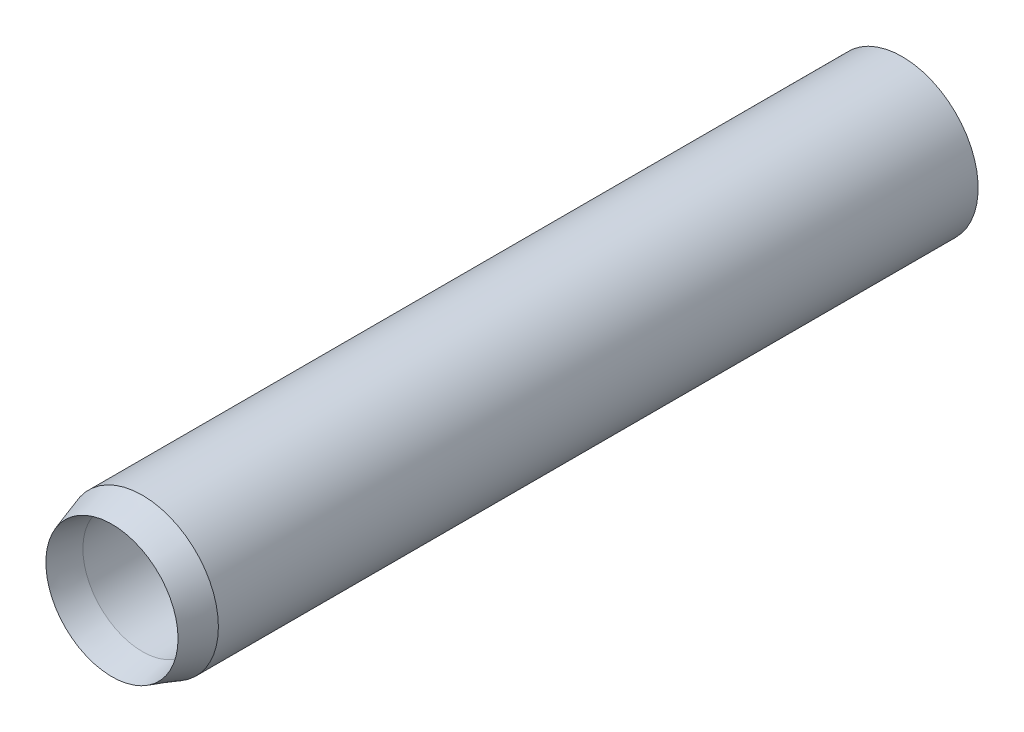
ISO-10303-21;
HEADER;
FILE_DESCRIPTION(('STEP AP214'),'2;1');
FILE_NAME('part.step','',(''),(''),'','','');
FILE_SCHEMA(('AUTOMOTIVE_DESIGN { 1 0 10303 214 1 1 1 1 }'));
ENDSEC;
DATA;
#1=APPLICATION_CONTEXT('core data for automotive mechanical design processes');
#2=APPLICATION_PROTOCOL_DEFINITION('international standard','automotive_design',2000,#1);
#3=PRODUCT_CONTEXT('',#1,'mechanical');
#4=PRODUCT('Part','Part','',(#3));
#5=PRODUCT_RELATED_PRODUCT_CATEGORY('part','',(#4));
#6=PRODUCT_DEFINITION_FORMATION('','',#4);
#7=PRODUCT_DEFINITION_CONTEXT('part definition',#1,'design');
#8=PRODUCT_DEFINITION('design','',#6,#7);
#9=PRODUCT_DEFINITION_SHAPE('','',#8);
#10=(LENGTH_UNIT() NAMED_UNIT(*) SI_UNIT(.MILLI.,.METRE.));
#11=(NAMED_UNIT(*) PLANE_ANGLE_UNIT() SI_UNIT($,.RADIAN.));
#12=(NAMED_UNIT(*) SI_UNIT($,.STERADIAN.) SOLID_ANGLE_UNIT());
#13=UNCERTAINTY_MEASURE_WITH_UNIT(LENGTH_MEASURE(1.E-05),#10,'distance_accuracy_value','');
#14=(GEOMETRIC_REPRESENTATION_CONTEXT(3) GLOBAL_UNCERTAINTY_ASSIGNED_CONTEXT((#13)) GLOBAL_UNIT_ASSIGNED_CONTEXT((#10,
#11,#12)) REPRESENTATION_CONTEXT('',''));
#15=CARTESIAN_POINT('',(0.,0.,0.));
#16=DIRECTION('',(0.,0.,1.));
#17=DIRECTION('',(1.,0.,0.));
#18=AXIS2_PLACEMENT_3D('',#15,#16,#17);
#19=CARTESIAN_POINT('',(5.5,8.176279441629,12.05003520962));
#20=DIRECTION('',(0.,0.,-1.));
#21=DIRECTION('',(0.500000000000017,-0.866025403784429,0.));
#22=AXIS2_PLACEMENT_3D('',#19,#20,#21);
#23=CONICAL_SURFACE('',#22,0.9350367653593,0.314013907387052);
#24=CARTESIAN_POINT('',(5.5,8.176279441629,11.8500000000009));
#25=DIRECTION('',(0.,0.,1.));
#26=DIRECTION('',(-1.,0.,0.));
#27=AXIS2_PLACEMENT_3D('',#24,#25,#26);
#28=CIRCLE('',#27,1.);
#29=CARTESIAN_POINT('',(4.5,8.176279441629,11.8500000000009));
#30=VERTEX_POINT('',#29);
#31=EDGE_CURVE('E40',#30,#30,#28,.T.);
#32=ORIENTED_EDGE('',*,*,#31,.T.);
#33=EDGE_LOOP('',(#32));
#34=FACE_BOUND('',#33,.T.);
#35=CARTESIAN_POINT('',(5.5,8.176279441629,12.2509258987048));
#36=DIRECTION('',(0.,0.,1.));
#37=DIRECTION('',(1.,0.,0.));
#38=AXIS2_PLACEMENT_3D('',#35,#36,#37);
#39=CIRCLE('',#38,0.869795706062809);
#40=CARTESIAN_POINT('',(6.36979570606281,8.176279441629,12.2509258987048));
#41=VERTEX_POINT('',#40);
#42=EDGE_CURVE('E10',#41,#41,#39,.T.);
#43=ORIENTED_EDGE('',*,*,#42,.F.);
#44=EDGE_LOOP('',(#43));
#45=FACE_BOUND('',#44,.T.);
#46=ADVANCED_FACE('F14',(#34,#45),#23,.T.);
#47=CARTESIAN_POINT('',(5.5,8.176279441629,12.05005653992));
#48=DIRECTION('',(0.,0.,1.));
#49=DIRECTION('',(-0.500000000000017,0.866025403784429,0.));
#50=AXIS2_PLACEMENT_3D('',#47,#48,#49);
#51=CONICAL_SURFACE('',#50,0.8265571952058,0.212021674546486);
#52=ORIENTED_EDGE('',*,*,#42,.T.);
#53=EDGE_LOOP('',(#52));
#54=FACE_BOUND('',#53,.T.);
#55=CARTESIAN_POINT('',(5.5,8.176279441629,11.85));
#56=DIRECTION('',(0.,0.,-1.));
#57=DIRECTION('',(0.500000000000017,-0.866025403784429,0.));
#58=AXIS2_PLACEMENT_3D('',#55,#56,#57);
#59=CIRCLE('',#58,0.7834936492);
#60=CARTESIAN_POINT('',(5.89174682460001,7.49775403771804,11.85));
#61=VERTEX_POINT('',#60);
#62=EDGE_CURVE('E21',#61,#61,#59,.T.);
#63=ORIENTED_EDGE('',*,*,#62,.T.);
#64=EDGE_LOOP('',(#63));
#65=FACE_BOUND('',#64,.T.);
#66=ADVANCED_FACE('F61',(#54,#65),#51,.F.);
#67=CARTESIAN_POINT('',(5.5,8.176279441629,11.85));
#68=DIRECTION('',(0.,0.,-1.));
#69=DIRECTION('',(0.500000000000017,-0.866025403784429,0.));
#70=AXIS2_PLACEMENT_3D('',#67,#68,#69);
#71=CYLINDRICAL_SURFACE('',#70,0.7834936492);
#72=CARTESIAN_POINT('',(5.5,8.176279441629,1.85));
#73=DIRECTION('',(0.,0.,1.));
#74=DIRECTION('',(1.,0.,0.));
#75=AXIS2_PLACEMENT_3D('',#72,#73,#74);
#76=CIRCLE('',#75,0.7834936492);
#77=CARTESIAN_POINT('',(6.2834936492,8.176279441629,1.85));
#78=VERTEX_POINT('',#77);
#79=EDGE_CURVE('E30',#78,#78,#76,.T.);
#80=ORIENTED_EDGE('',*,*,#79,.F.);
#81=EDGE_LOOP('',(#80));
#82=FACE_BOUND('',#81,.T.);
#83=ORIENTED_EDGE('',*,*,#62,.F.);
#84=EDGE_LOOP('',(#83));
#85=FACE_BOUND('',#84,.T.);
#86=ADVANCED_FACE('F66',(#82,#85),#71,.F.);
#87=CARTESIAN_POINT('',(5.5,8.176279441629,1.85));
#88=DIRECTION('',(0.,0.,-1.));
#89=DIRECTION('',(0.,-1.,0.));
#90=AXIS2_PLACEMENT_3D('',#87,#88,#89);
#91=PLANE('',#90);
#92=CARTESIAN_POINT('',(5.5,8.176279441629,1.85));
#93=DIRECTION('',(0.,0.,-1.));
#94=DIRECTION('',(0.500000000000017,-0.866025403784429,0.));
#95=AXIS2_PLACEMENT_3D('',#92,#93,#94);
#96=CIRCLE('',#95,1.);
#97=CARTESIAN_POINT('',(6.00000000000002,7.31025403784457,1.85));
#98=VERTEX_POINT('',#97);
#99=EDGE_CURVE('E37',#98,#98,#96,.T.);
#100=ORIENTED_EDGE('',*,*,#99,.T.);
#101=EDGE_LOOP('',(#100));
#102=FACE_BOUND('',#101,.T.);
#103=ORIENTED_EDGE('',*,*,#79,.T.);
#104=EDGE_LOOP('',(#103));
#105=FACE_BOUND('',#104,.T.);
#106=ADVANCED_FACE('F50',(#102,#105),#91,.T.);
#107=CARTESIAN_POINT('',(5.5,8.176279441629,11.85));
#108=DIRECTION('',(0.,0.,-1.));
#109=DIRECTION('',(0.500000000000017,-0.866025403784429,0.));
#110=AXIS2_PLACEMENT_3D('',#107,#108,#109);
#111=CYLINDRICAL_SURFACE('',#110,1.);
#112=ORIENTED_EDGE('',*,*,#99,.F.);
#113=EDGE_LOOP('',(#112));
#114=FACE_BOUND('',#113,.T.);
#115=ORIENTED_EDGE('',*,*,#31,.F.);
#116=EDGE_LOOP('',(#115));
#117=FACE_BOUND('',#116,.T.);
#118=ADVANCED_FACE('F53',(#114,#117),#111,.T.);
#119=CLOSED_SHELL('',(#46,#66,#86,#106,#118));
#120=MANIFOLD_SOLID_BREP('B1',#119);
#121=ADVANCED_BREP_SHAPE_REPRESENTATION('',(#18,#120),#14);
#122=SHAPE_DEFINITION_REPRESENTATION(#9,#121);
ENDSEC;
END-ISO-10303-21;
